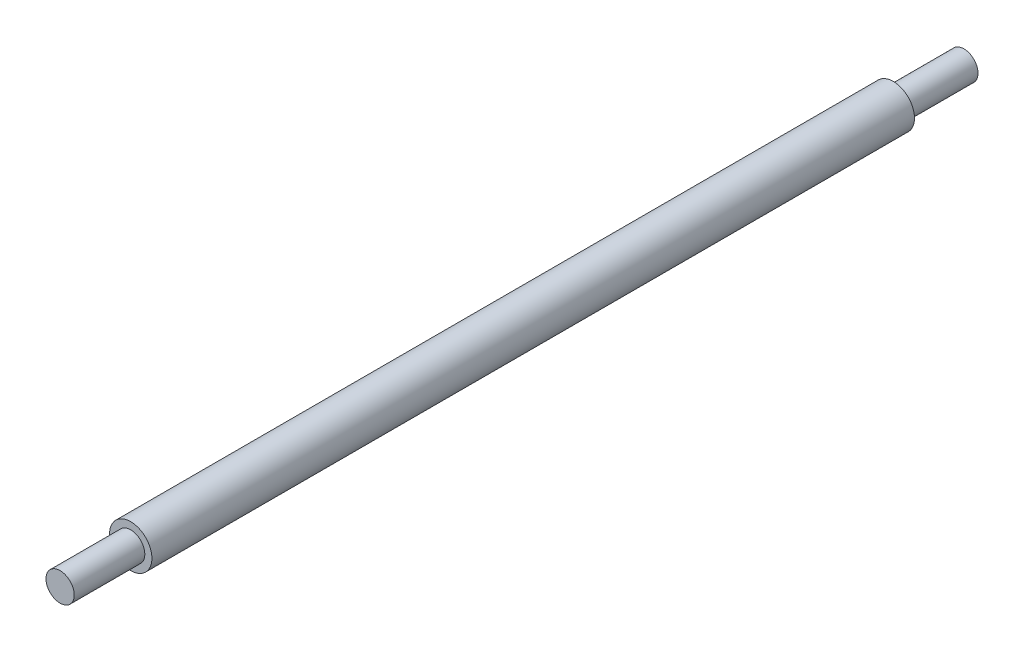
ISO-10303-21;
HEADER;
FILE_DESCRIPTION(('STEP AP214'),'2;1');
FILE_NAME('part.step','',(''),(''),'','','');
FILE_SCHEMA(('AUTOMOTIVE_DESIGN { 1 0 10303 214 1 1 1 1 }'));
ENDSEC;
DATA;
#1=APPLICATION_CONTEXT('core data for automotive mechanical design processes');
#2=APPLICATION_PROTOCOL_DEFINITION('international standard','automotive_design',2000,#1);
#3=PRODUCT_CONTEXT('',#1,'mechanical');
#4=PRODUCT('Part','Part','',(#3));
#5=PRODUCT_RELATED_PRODUCT_CATEGORY('part','',(#4));
#6=PRODUCT_DEFINITION_FORMATION('','',#4);
#7=PRODUCT_DEFINITION_CONTEXT('part definition',#1,'design');
#8=PRODUCT_DEFINITION('design','',#6,#7);
#9=PRODUCT_DEFINITION_SHAPE('','',#8);
#10=(LENGTH_UNIT() NAMED_UNIT(*) SI_UNIT(.MILLI.,.METRE.));
#11=(NAMED_UNIT(*) PLANE_ANGLE_UNIT() SI_UNIT($,.RADIAN.));
#12=(NAMED_UNIT(*) SI_UNIT($,.STERADIAN.) SOLID_ANGLE_UNIT());
#13=UNCERTAINTY_MEASURE_WITH_UNIT(LENGTH_MEASURE(1.E-05),#10,'distance_accuracy_value','');
#14=(GEOMETRIC_REPRESENTATION_CONTEXT(3) GLOBAL_UNCERTAINTY_ASSIGNED_CONTEXT((#13)) GLOBAL_UNIT_ASSIGNED_CONTEXT((#10,
#11,#12)) REPRESENTATION_CONTEXT('',''));
#15=CARTESIAN_POINT('',(0.,0.,0.));
#16=DIRECTION('',(0.,0.,1.));
#17=DIRECTION('',(1.,0.,0.));
#18=AXIS2_PLACEMENT_3D('',#15,#16,#17);
#19=CARTESIAN_POINT('',(0.,0.,342.9));
#20=DIRECTION('',(0.,0.,-1.));
#21=DIRECTION('',(-1.,0.,0.));
#22=AXIS2_PLACEMENT_3D('',#19,#20,#21);
#23=CYLINDRICAL_SURFACE('',#22,9.525);
#24=CARTESIAN_POINT('',(0.,0.,342.9));
#25=DIRECTION('',(0.,0.,1.));
#26=DIRECTION('',(1.,0.,0.));
#27=AXIS2_PLACEMENT_3D('',#24,#25,#26);
#28=CIRCLE('',#27,9.525);
#29=CARTESIAN_POINT('',(9.525,0.,342.9));
#30=VERTEX_POINT('',#29);
#31=EDGE_CURVE('E43',#30,#30,#28,.T.);
#32=ORIENTED_EDGE('',*,*,#31,.F.);
#33=EDGE_LOOP('',(#32));
#34=FACE_BOUND('',#33,.T.);
#35=CARTESIAN_POINT('',(0.,0.,0.));
#36=DIRECTION('',(0.,0.,1.));
#37=DIRECTION('',(1.,0.,0.));
#38=AXIS2_PLACEMENT_3D('',#35,#36,#37);
#39=CIRCLE('',#38,9.525);
#40=CARTESIAN_POINT('',(9.525,0.,0.));
#41=VERTEX_POINT('',#40);
#42=EDGE_CURVE('E34',#41,#41,#39,.T.);
#43=ORIENTED_EDGE('',*,*,#42,.T.);
#44=EDGE_LOOP('',(#43));
#45=FACE_BOUND('',#44,.T.);
#46=ADVANCED_FACE('F31',(#34,#45),#23,.T.);
#47=CARTESIAN_POINT('',(0.,0.,342.9));
#48=DIRECTION('',(0.,0.,1.));
#49=DIRECTION('',(1.,0.,0.));
#50=AXIS2_PLACEMENT_3D('',#47,#48,#49);
#51=PLANE('',#50);
#52=CARTESIAN_POINT('',(0.,0.,342.9));
#53=DIRECTION('',(0.,0.,1.));
#54=DIRECTION('',(1.,0.,0.));
#55=AXIS2_PLACEMENT_3D('',#52,#53,#54);
#56=CIRCLE('',#55,6.35);
#57=CARTESIAN_POINT('',(6.35,0.,342.9));
#58=VERTEX_POINT('',#57);
#59=EDGE_CURVE('E38',#58,#58,#56,.T.);
#60=ORIENTED_EDGE('',*,*,#59,.F.);
#61=EDGE_LOOP('',(#60));
#62=FACE_BOUND('',#61,.T.);
#63=ORIENTED_EDGE('',*,*,#31,.T.);
#64=EDGE_LOOP('',(#63));
#65=FACE_BOUND('',#64,.T.);
#66=ADVANCED_FACE('F60',(#62,#65),#51,.T.);
#67=CARTESIAN_POINT('',(0.,0.,0.));
#68=DIRECTION('',(0.,0.,1.));
#69=DIRECTION('',(1.,0.,0.));
#70=AXIS2_PLACEMENT_3D('',#67,#68,#69);
#71=PLANE('',#70);
#72=CARTESIAN_POINT('',(0.,0.,0.));
#73=DIRECTION('',(0.,0.,-1.));
#74=DIRECTION('',(-1.,0.,0.));
#75=AXIS2_PLACEMENT_3D('',#72,#73,#74);
#76=CIRCLE('',#75,6.35);
#77=CARTESIAN_POINT('',(-6.35,0.,0.));
#78=VERTEX_POINT('',#77);
#79=EDGE_CURVE('E10',#78,#78,#76,.T.);
#80=ORIENTED_EDGE('',*,*,#79,.F.);
#81=EDGE_LOOP('',(#80));
#82=FACE_BOUND('',#81,.T.);
#83=ORIENTED_EDGE('',*,*,#42,.F.);
#84=EDGE_LOOP('',(#83));
#85=FACE_BOUND('',#84,.T.);
#86=ADVANCED_FACE('F57',(#82,#85),#71,.F.);
#87=CARTESIAN_POINT('',(0.,0.,374.65));
#88=DIRECTION('',(0.,0.,-1.));
#89=DIRECTION('',(-1.,0.,0.));
#90=AXIS2_PLACEMENT_3D('',#87,#88,#89);
#91=CYLINDRICAL_SURFACE('',#90,6.35);
#92=CARTESIAN_POINT('',(0.,0.,374.65));
#93=DIRECTION('',(0.,0.,1.));
#94=DIRECTION('',(1.,0.,0.));
#95=AXIS2_PLACEMENT_3D('',#92,#93,#94);
#96=CIRCLE('',#95,6.35);
#97=CARTESIAN_POINT('',(6.35,0.,374.65));
#98=VERTEX_POINT('',#97);
#99=EDGE_CURVE('E48',#98,#98,#96,.T.);
#100=ORIENTED_EDGE('',*,*,#99,.F.);
#101=EDGE_LOOP('',(#100));
#102=FACE_BOUND('',#101,.T.);
#103=ORIENTED_EDGE('',*,*,#59,.T.);
#104=EDGE_LOOP('',(#103));
#105=FACE_BOUND('',#104,.T.);
#106=ADVANCED_FACE('F59',(#102,#105),#91,.T.);
#107=CARTESIAN_POINT('',(0.,0.,374.65));
#108=DIRECTION('',(0.,0.,1.));
#109=DIRECTION('',(1.,0.,0.));
#110=AXIS2_PLACEMENT_3D('',#107,#108,#109);
#111=PLANE('',#110);
#112=ORIENTED_EDGE('',*,*,#99,.T.);
#113=EDGE_LOOP('',(#112));
#114=FACE_BOUND('',#113,.T.);
#115=ADVANCED_FACE('F66',(#114),#111,.T.);
#116=CARTESIAN_POINT('',(0.,0.,-31.75));
#117=DIRECTION('',(0.,0.,1.));
#118=DIRECTION('',(1.,0.,0.));
#119=AXIS2_PLACEMENT_3D('',#116,#117,#118);
#120=CYLINDRICAL_SURFACE('',#119,6.35);
#121=CARTESIAN_POINT('',(0.,0.,-31.75));
#122=DIRECTION('',(0.,0.,-1.));
#123=DIRECTION('',(-1.,0.,0.));
#124=AXIS2_PLACEMENT_3D('',#121,#122,#123);
#125=CIRCLE('',#124,6.35);
#126=CARTESIAN_POINT('',(-6.35,0.,-31.75));
#127=VERTEX_POINT('',#126);
#128=EDGE_CURVE('E47',#127,#127,#125,.T.);
#129=ORIENTED_EDGE('',*,*,#128,.F.);
#130=EDGE_LOOP('',(#129));
#131=FACE_BOUND('',#130,.T.);
#132=ORIENTED_EDGE('',*,*,#79,.T.);
#133=EDGE_LOOP('',(#132));
#134=FACE_BOUND('',#133,.T.);
#135=ADVANCED_FACE('F94',(#131,#134),#120,.T.);
#136=CARTESIAN_POINT('',(0.,0.,-31.75));
#137=DIRECTION('',(0.,0.,-1.));
#138=DIRECTION('',(-1.,0.,0.));
#139=AXIS2_PLACEMENT_3D('',#136,#137,#138);
#140=PLANE('',#139);
#141=ORIENTED_EDGE('',*,*,#128,.T.);
#142=EDGE_LOOP('',(#141));
#143=FACE_BOUND('',#142,.T.);
#144=ADVANCED_FACE('F108',(#143),#140,.T.);
#145=CLOSED_SHELL('',(#46,#66,#86,#106,#115,#135,#144));
#146=MANIFOLD_SOLID_BREP('B2',#145);
#147=ADVANCED_BREP_SHAPE_REPRESENTATION('',(#18,#146),#14);
#148=SHAPE_DEFINITION_REPRESENTATION(#9,#147);
ENDSEC;
END-ISO-10303-21;
